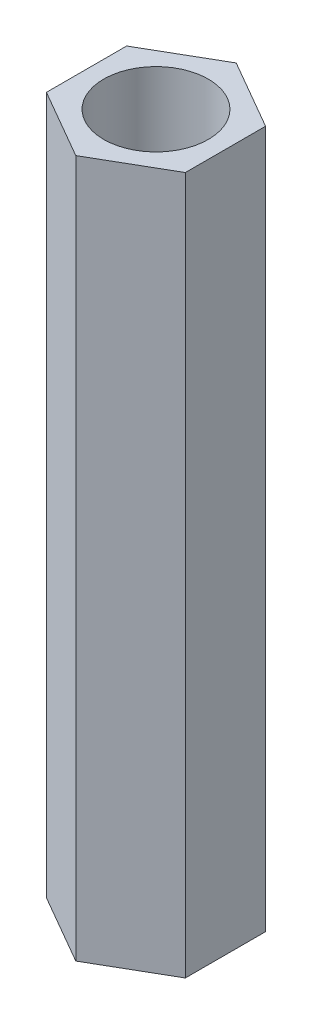
ISO-10303-21;
HEADER;
FILE_DESCRIPTION(('STEP AP214'),'2;1');
FILE_NAME('part.step','',(''),(''),'','','');
FILE_SCHEMA(('AUTOMOTIVE_DESIGN { 1 0 10303 214 1 1 1 1 }'));
ENDSEC;
DATA;
#1=APPLICATION_CONTEXT('core data for automotive mechanical design processes');
#2=APPLICATION_PROTOCOL_DEFINITION('international standard','automotive_design',2000,#1);
#3=PRODUCT_CONTEXT('',#1,'mechanical');
#4=PRODUCT('Part','Part','',(#3));
#5=PRODUCT_RELATED_PRODUCT_CATEGORY('part','',(#4));
#6=PRODUCT_DEFINITION_FORMATION('','',#4);
#7=PRODUCT_DEFINITION_CONTEXT('part definition',#1,'design');
#8=PRODUCT_DEFINITION('design','',#6,#7);
#9=PRODUCT_DEFINITION_SHAPE('','',#8);
#10=(LENGTH_UNIT() NAMED_UNIT(*) SI_UNIT(.MILLI.,.METRE.));
#11=(NAMED_UNIT(*) PLANE_ANGLE_UNIT() SI_UNIT($,.RADIAN.));
#12=(NAMED_UNIT(*) SI_UNIT($,.STERADIAN.) SOLID_ANGLE_UNIT());
#13=UNCERTAINTY_MEASURE_WITH_UNIT(LENGTH_MEASURE(1.E-05),#10,'distance_accuracy_value','');
#14=(GEOMETRIC_REPRESENTATION_CONTEXT(3) GLOBAL_UNCERTAINTY_ASSIGNED_CONTEXT((#13)) GLOBAL_UNIT_ASSIGNED_CONTEXT((#10,
#11,#12)) REPRESENTATION_CONTEXT('',''));
#15=CARTESIAN_POINT('',(0.,0.,0.));
#16=DIRECTION('',(0.,0.,1.));
#17=DIRECTION('',(1.,0.,0.));
#18=AXIS2_PLACEMENT_3D('',#15,#16,#17);
#19=CARTESIAN_POINT('',(0.,20.,0.));
#20=DIRECTION('',(0.,1.,0.));
#21=DIRECTION('',(0.,0.,1.));
#22=AXIS2_PLACEMENT_3D('',#19,#20,#21);
#23=PLANE('',#22);
#24=DIRECTION('',(0.,0.,-1.));
#25=VECTOR('',#24,1.);
#26=CARTESIAN_POINT('',(1.99185842870422,20.,1.14999999999998));
#27=LINE('',#26,#25);
#28=CARTESIAN_POINT('',(1.99185842870422,20.,1.14999999999998));
#29=VERTEX_POINT('',#28);
#30=CARTESIAN_POINT('',(1.9918584287042,20.,-1.15000000000002));
#31=VERTEX_POINT('',#30);
#32=EDGE_CURVE('E150',#29,#31,#27,.T.);
#33=ORIENTED_EDGE('',*,*,#32,.T.);
#34=DIRECTION('',(-0.866025403784443,0.,-0.499999999999992));
#35=VECTOR('',#34,1.);
#36=CARTESIAN_POINT('',(1.9918584287042,20.,-1.15000000000002));
#37=LINE('',#36,#35);
#38=CARTESIAN_POINT('',(0.,20.,-2.3));
#39=VERTEX_POINT('',#38);
#40=EDGE_CURVE('E98',#31,#39,#37,.T.);
#41=ORIENTED_EDGE('',*,*,#40,.T.);
#42=DIRECTION('',(-0.866025403784434,0.,0.500000000000008));
#43=VECTOR('',#42,1.);
#44=CARTESIAN_POINT('',(0.,20.,-2.3));
#45=LINE('',#44,#43);
#46=CARTESIAN_POINT('',(-1.99185842870422,20.,-1.14999999999998));
#47=VERTEX_POINT('',#46);
#48=EDGE_CURVE('E111',#39,#47,#45,.T.);
#49=ORIENTED_EDGE('',*,*,#48,.T.);
#50=DIRECTION('',(0.,0.,1.));
#51=VECTOR('',#50,1.);
#52=CARTESIAN_POINT('',(-1.99185842870422,20.,-1.14999999999998));
#53=LINE('',#52,#51);
#54=CARTESIAN_POINT('',(-1.9918584287042,20.,1.15000000000002));
#55=VERTEX_POINT('',#54);
#56=EDGE_CURVE('E105',#47,#55,#53,.T.);
#57=ORIENTED_EDGE('',*,*,#56,.T.);
#58=DIRECTION('',(0.866025403784443,0.,0.499999999999992));
#59=VECTOR('',#58,1.);
#60=CARTESIAN_POINT('',(-1.9918584287042,20.,1.15000000000002));
#61=LINE('',#60,#59);
#62=CARTESIAN_POINT('',(0.,20.,2.3));
#63=VERTEX_POINT('',#62);
#64=EDGE_CURVE('E109',#55,#63,#61,.T.);
#65=ORIENTED_EDGE('',*,*,#64,.T.);
#66=DIRECTION('',(0.866025403784434,0.,-0.500000000000008));
#67=VECTOR('',#66,1.);
#68=CARTESIAN_POINT('',(0.,20.,2.3));
#69=LINE('',#68,#67);
#70=EDGE_CURVE('E61',#63,#29,#69,.T.);
#71=ORIENTED_EDGE('',*,*,#70,.T.);
#72=EDGE_LOOP('',(#33,#41,#49,#57,#65,#71));
#73=FACE_BOUND('',#72,.T.);
#74=CARTESIAN_POINT('',(0.,20.,0.));
#75=DIRECTION('',(0.,1.,0.));
#76=DIRECTION('',(0.,0.,1.));
#77=AXIS2_PLACEMENT_3D('',#74,#75,#76);
#78=CIRCLE('',#77,1.5);
#79=CARTESIAN_POINT('',(0.,20.,1.5));
#80=VERTEX_POINT('',#79);
#81=EDGE_CURVE('E138',#80,#80,#78,.T.);
#82=ORIENTED_EDGE('',*,*,#81,.F.);
#83=EDGE_LOOP('',(#82));
#84=FACE_BOUND('',#83,.T.);
#85=ADVANCED_FACE('F43',(#73,#84),#23,.T.);
#86=CARTESIAN_POINT('',(0.,0.,0.));
#87=DIRECTION('',(0.,1.,0.));
#88=DIRECTION('',(0.,0.,1.));
#89=AXIS2_PLACEMENT_3D('',#86,#87,#88);
#90=PLANE('',#89);
#91=DIRECTION('',(0.,0.,-1.));
#92=VECTOR('',#91,1.);
#93=CARTESIAN_POINT('',(1.99185842870422,0.,1.14999999999998));
#94=LINE('',#93,#92);
#95=CARTESIAN_POINT('',(1.99185842870422,0.,1.14999999999998));
#96=VERTEX_POINT('',#95);
#97=CARTESIAN_POINT('',(1.9918584287042,0.,-1.15000000000002));
#98=VERTEX_POINT('',#97);
#99=EDGE_CURVE('E133',#96,#98,#94,.T.);
#100=ORIENTED_EDGE('',*,*,#99,.F.);
#101=DIRECTION('',(0.866025403784434,0.,-0.500000000000008));
#102=VECTOR('',#101,1.);
#103=CARTESIAN_POINT('',(0.,0.,2.3));
#104=LINE('',#103,#102);
#105=CARTESIAN_POINT('',(0.,0.,2.3));
#106=VERTEX_POINT('',#105);
#107=EDGE_CURVE('E90',#106,#96,#104,.T.);
#108=ORIENTED_EDGE('',*,*,#107,.F.);
#109=DIRECTION('',(0.866025403784443,0.,0.499999999999992));
#110=VECTOR('',#109,1.);
#111=CARTESIAN_POINT('',(-1.9918584287042,0.,1.15000000000002));
#112=LINE('',#111,#110);
#113=CARTESIAN_POINT('',(-1.9918584287042,0.,1.15000000000002));
#114=VERTEX_POINT('',#113);
#115=EDGE_CURVE('E84',#114,#106,#112,.T.);
#116=ORIENTED_EDGE('',*,*,#115,.F.);
#117=DIRECTION('',(0.,0.,1.));
#118=VECTOR('',#117,1.);
#119=CARTESIAN_POINT('',(-1.99185842870422,0.,-1.14999999999998));
#120=LINE('',#119,#118);
#121=CARTESIAN_POINT('',(-1.99185842870422,0.,-1.14999999999998));
#122=VERTEX_POINT('',#121);
#123=EDGE_CURVE('E120',#122,#114,#120,.T.);
#124=ORIENTED_EDGE('',*,*,#123,.F.);
#125=DIRECTION('',(-0.866025403784434,0.,0.500000000000008));
#126=VECTOR('',#125,1.);
#127=CARTESIAN_POINT('',(0.,0.,-2.3));
#128=LINE('',#127,#126);
#129=CARTESIAN_POINT('',(0.,0.,-2.3));
#130=VERTEX_POINT('',#129);
#131=EDGE_CURVE('E141',#130,#122,#128,.T.);
#132=ORIENTED_EDGE('',*,*,#131,.F.);
#133=DIRECTION('',(-0.866025403784443,0.,-0.499999999999992));
#134=VECTOR('',#133,1.);
#135=CARTESIAN_POINT('',(1.9918584287042,0.,-1.15000000000002));
#136=LINE('',#135,#134);
#137=EDGE_CURVE('E137',#98,#130,#136,.T.);
#138=ORIENTED_EDGE('',*,*,#137,.F.);
#139=EDGE_LOOP('',(#100,#108,#116,#124,#132,#138));
#140=FACE_BOUND('',#139,.T.);
#141=CARTESIAN_POINT('',(0.,0.,0.));
#142=DIRECTION('',(0.,1.,0.));
#143=DIRECTION('',(0.,0.,1.));
#144=AXIS2_PLACEMENT_3D('',#141,#142,#143);
#145=CIRCLE('',#144,1.5);
#146=CARTESIAN_POINT('',(0.,0.,1.5));
#147=VERTEX_POINT('',#146);
#148=EDGE_CURVE('E265',#147,#147,#145,.T.);
#149=ORIENTED_EDGE('',*,*,#148,.T.);
#150=EDGE_LOOP('',(#149));
#151=FACE_BOUND('',#150,.T.);
#152=ADVANCED_FACE('F163',(#140,#151),#90,.F.);
#153=CARTESIAN_POINT('',(1.99185842870422,20.,1.14999999999998));
#154=DIRECTION('',(-1.,0.,0.));
#155=DIRECTION('',(0.,0.,1.));
#156=AXIS2_PLACEMENT_3D('',#153,#154,#155);
#157=PLANE('',#156);
#158=ORIENTED_EDGE('',*,*,#99,.T.);
#159=DIRECTION('',(0.,-1.,0.));
#160=VECTOR('',#159,1.);
#161=CARTESIAN_POINT('',(1.9918584287042,20.,-1.15000000000002));
#162=LINE('',#161,#160);
#163=EDGE_CURVE('E11',#31,#98,#162,.T.);
#164=ORIENTED_EDGE('',*,*,#163,.F.);
#165=ORIENTED_EDGE('',*,*,#32,.F.);
#166=DIRECTION('',(0.,-1.,0.));
#167=VECTOR('',#166,1.);
#168=CARTESIAN_POINT('',(1.99185842870422,20.,1.14999999999998));
#169=LINE('',#168,#167);
#170=EDGE_CURVE('E129',#29,#96,#169,.T.);
#171=ORIENTED_EDGE('',*,*,#170,.T.);
#172=EDGE_LOOP('',(#158,#164,#165,#171));
#173=FACE_BOUND('',#172,.T.);
#174=ADVANCED_FACE('F45',(#173),#157,.F.);
#175=CARTESIAN_POINT('',(1.9918584287042,20.,-1.15000000000002));
#176=DIRECTION('',(-0.499999999999992,0.,0.866025403784443));
#177=DIRECTION('',(0.866025403784443,0.,0.499999999999992));
#178=AXIS2_PLACEMENT_3D('',#175,#176,#177);
#179=PLANE('',#178);
#180=ORIENTED_EDGE('',*,*,#137,.T.);
#181=DIRECTION('',(0.,-1.,0.));
#182=VECTOR('',#181,1.);
#183=CARTESIAN_POINT('',(0.,20.,-2.3));
#184=LINE('',#183,#182);
#185=EDGE_CURVE('E53',#39,#130,#184,.T.);
#186=ORIENTED_EDGE('',*,*,#185,.F.);
#187=ORIENTED_EDGE('',*,*,#40,.F.);
#188=ORIENTED_EDGE('',*,*,#163,.T.);
#189=EDGE_LOOP('',(#180,#186,#187,#188));
#190=FACE_BOUND('',#189,.T.);
#191=ADVANCED_FACE('F188',(#190),#179,.F.);
#192=CARTESIAN_POINT('',(0.,20.,-2.3));
#193=DIRECTION('',(0.500000000000008,0.,0.866025403784434));
#194=DIRECTION('',(0.866025403784434,0.,-0.500000000000008));
#195=AXIS2_PLACEMENT_3D('',#192,#193,#194);
#196=PLANE('',#195);
#197=ORIENTED_EDGE('',*,*,#131,.T.);
#198=DIRECTION('',(0.,-1.,0.));
#199=VECTOR('',#198,1.);
#200=CARTESIAN_POINT('',(-1.99185842870422,20.,-1.14999999999998));
#201=LINE('',#200,#199);
#202=EDGE_CURVE('E122',#47,#122,#201,.T.);
#203=ORIENTED_EDGE('',*,*,#202,.F.);
#204=ORIENTED_EDGE('',*,*,#48,.F.);
#205=ORIENTED_EDGE('',*,*,#185,.T.);
#206=EDGE_LOOP('',(#197,#203,#204,#205));
#207=FACE_BOUND('',#206,.T.);
#208=ADVANCED_FACE('F160',(#207),#196,.F.);
#209=CARTESIAN_POINT('',(-1.99185842870422,20.,-1.14999999999998));
#210=DIRECTION('',(1.,0.,0.));
#211=DIRECTION('',(0.,0.,-1.));
#212=AXIS2_PLACEMENT_3D('',#209,#210,#211);
#213=PLANE('',#212);
#214=ORIENTED_EDGE('',*,*,#123,.T.);
#215=DIRECTION('',(0.,-1.,0.));
#216=VECTOR('',#215,1.);
#217=CARTESIAN_POINT('',(-1.9918584287042,20.,1.15000000000002));
#218=LINE('',#217,#216);
#219=EDGE_CURVE('E117',#55,#114,#218,.T.);
#220=ORIENTED_EDGE('',*,*,#219,.F.);
#221=ORIENTED_EDGE('',*,*,#56,.F.);
#222=ORIENTED_EDGE('',*,*,#202,.T.);
#223=EDGE_LOOP('',(#214,#220,#221,#222));
#224=FACE_BOUND('',#223,.T.);
#225=ADVANCED_FACE('F118',(#224),#213,.F.);
#226=CARTESIAN_POINT('',(-1.9918584287042,20.,1.15000000000002));
#227=DIRECTION('',(0.499999999999992,0.,-0.866025403784443));
#228=DIRECTION('',(-0.866025403784443,0.,-0.499999999999992));
#229=AXIS2_PLACEMENT_3D('',#226,#227,#228);
#230=PLANE('',#229);
#231=ORIENTED_EDGE('',*,*,#115,.T.);
#232=DIRECTION('',(0.,-1.,0.));
#233=VECTOR('',#232,1.);
#234=CARTESIAN_POINT('',(0.,20.,2.3));
#235=LINE('',#234,#233);
#236=EDGE_CURVE('E123',#63,#106,#235,.T.);
#237=ORIENTED_EDGE('',*,*,#236,.F.);
#238=ORIENTED_EDGE('',*,*,#64,.F.);
#239=ORIENTED_EDGE('',*,*,#219,.T.);
#240=EDGE_LOOP('',(#231,#237,#238,#239));
#241=FACE_BOUND('',#240,.T.);
#242=ADVANCED_FACE('F125',(#241),#230,.F.);
#243=CARTESIAN_POINT('',(0.,20.,2.3));
#244=DIRECTION('',(-0.500000000000008,0.,-0.866025403784434));
#245=DIRECTION('',(-0.866025403784434,0.,0.500000000000008));
#246=AXIS2_PLACEMENT_3D('',#243,#244,#245);
#247=PLANE('',#246);
#248=ORIENTED_EDGE('',*,*,#107,.T.);
#249=ORIENTED_EDGE('',*,*,#170,.F.);
#250=ORIENTED_EDGE('',*,*,#70,.F.);
#251=ORIENTED_EDGE('',*,*,#236,.T.);
#252=EDGE_LOOP('',(#248,#249,#250,#251));
#253=FACE_BOUND('',#252,.T.);
#254=ADVANCED_FACE('F168',(#253),#247,.F.);
#255=CARTESIAN_POINT('',(0.,20.,0.));
#256=DIRECTION('',(0.,-1.,0.));
#257=DIRECTION('',(0.,0.,-1.));
#258=AXIS2_PLACEMENT_3D('',#255,#256,#257);
#259=CYLINDRICAL_SURFACE('',#258,1.5);
#260=ORIENTED_EDGE('',*,*,#81,.T.);
#261=EDGE_LOOP('',(#260));
#262=FACE_BOUND('',#261,.T.);
#263=ORIENTED_EDGE('',*,*,#148,.F.);
#264=EDGE_LOOP('',(#263));
#265=FACE_BOUND('',#264,.T.);
#266=ADVANCED_FACE('F170',(#262,#265),#259,.F.);
#267=CLOSED_SHELL('',(#85,#152,#174,#191,#208,#225,#242,#254,#266));
#268=MANIFOLD_SOLID_BREP('B2',#267);
#269=ADVANCED_BREP_SHAPE_REPRESENTATION('',(#18,#268),#14);
#270=SHAPE_DEFINITION_REPRESENTATION(#9,#269);
ENDSEC;
END-ISO-10303-21;
